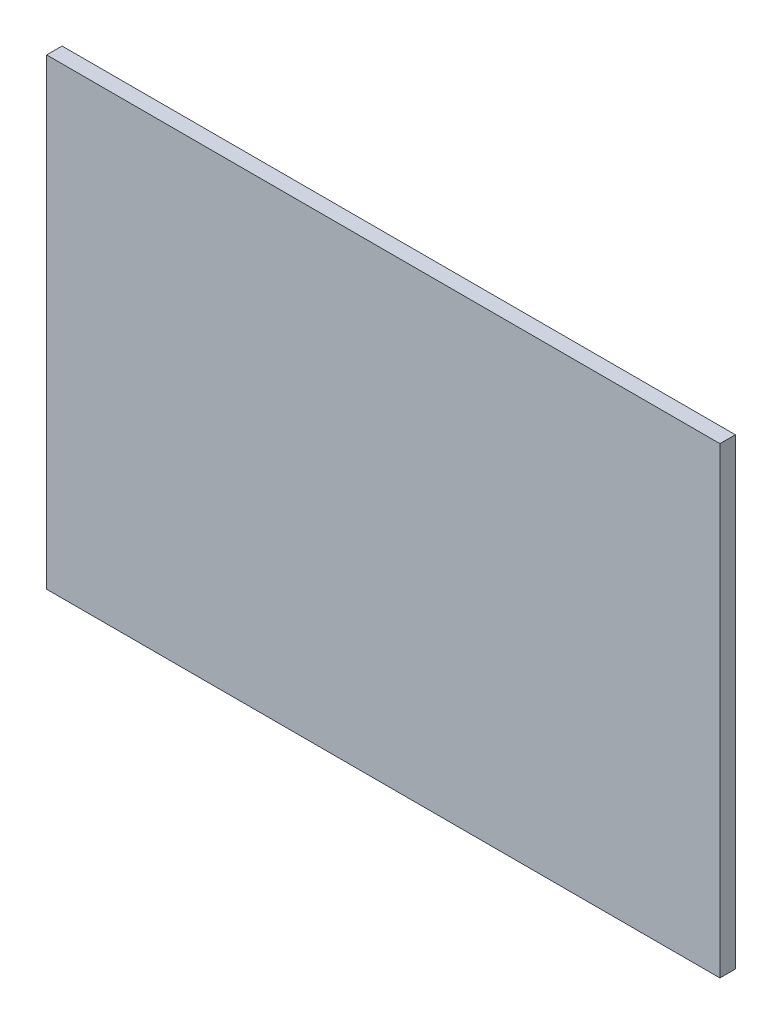
ISO-10303-21;
HEADER;
FILE_DESCRIPTION(('STEP AP214'),'2;1');
FILE_NAME('part.step','',(''),(''),'','','');
FILE_SCHEMA(('AUTOMOTIVE_DESIGN { 1 0 10303 214 1 1 1 1 }'));
ENDSEC;
DATA;
#1=APPLICATION_CONTEXT('core data for automotive mechanical design processes');
#2=APPLICATION_PROTOCOL_DEFINITION('international standard','automotive_design',2000,#1);
#3=PRODUCT_CONTEXT('',#1,'mechanical');
#4=PRODUCT('Part','Part','',(#3));
#5=PRODUCT_RELATED_PRODUCT_CATEGORY('part','',(#4));
#6=PRODUCT_DEFINITION_FORMATION('','',#4);
#7=PRODUCT_DEFINITION_CONTEXT('part definition',#1,'design');
#8=PRODUCT_DEFINITION('design','',#6,#7);
#9=PRODUCT_DEFINITION_SHAPE('','',#8);
#10=(LENGTH_UNIT() NAMED_UNIT(*) SI_UNIT(.MILLI.,.METRE.));
#11=(NAMED_UNIT(*) PLANE_ANGLE_UNIT() SI_UNIT($,.RADIAN.));
#12=(NAMED_UNIT(*) SI_UNIT($,.STERADIAN.) SOLID_ANGLE_UNIT());
#13=UNCERTAINTY_MEASURE_WITH_UNIT(LENGTH_MEASURE(1.E-05),#10,'distance_accuracy_value','');
#14=(GEOMETRIC_REPRESENTATION_CONTEXT(3) GLOBAL_UNCERTAINTY_ASSIGNED_CONTEXT((#13)) GLOBAL_UNIT_ASSIGNED_CONTEXT((#10,
#11,#12)) REPRESENTATION_CONTEXT('',''));
#15=CARTESIAN_POINT('',(0.,0.,0.));
#16=DIRECTION('',(0.,0.,1.));
#17=DIRECTION('',(1.,0.,0.));
#18=AXIS2_PLACEMENT_3D('',#15,#16,#17);
#19=CARTESIAN_POINT('',(-52.5537313432836,24.2138059701493,2.));
#20=DIRECTION('',(1.,0.,0.));
#21=DIRECTION('',(0.,1.,0.));
#22=AXIS2_PLACEMENT_3D('',#19,#20,#21);
#23=PLANE('',#22);
#24=DIRECTION('',(0.,-1.,0.));
#25=VECTOR('',#24,1.);
#26=CARTESIAN_POINT('',(-52.5537313432836,24.2138059701493,0.));
#27=LINE('',#26,#25);
#28=CARTESIAN_POINT('',(-52.5537313432836,24.2138059701493,0.));
#29=VERTEX_POINT('',#28);
#30=CARTESIAN_POINT('',(-52.5537313432836,-35.7861940298507,0.));
#31=VERTEX_POINT('',#30);
#32=EDGE_CURVE('E96',#29,#31,#27,.T.);
#33=ORIENTED_EDGE('',*,*,#32,.T.);
#34=DIRECTION('',(0.,0.,-1.));
#35=VECTOR('',#34,1.);
#36=CARTESIAN_POINT('',(-52.5537313432836,-35.7861940298507,2.));
#37=LINE('',#36,#35);
#38=CARTESIAN_POINT('',(-52.5537313432836,-35.7861940298507,2.));
#39=VERTEX_POINT('',#38);
#40=EDGE_CURVE('E11',#39,#31,#37,.T.);
#41=ORIENTED_EDGE('',*,*,#40,.F.);
#42=DIRECTION('',(0.,-1.,0.));
#43=VECTOR('',#42,1.);
#44=CARTESIAN_POINT('',(-52.5537313432836,24.2138059701493,2.));
#45=LINE('',#44,#43);
#46=CARTESIAN_POINT('',(-52.5537313432836,24.2138059701493,2.));
#47=VERTEX_POINT('',#46);
#48=EDGE_CURVE('E84',#47,#39,#45,.T.);
#49=ORIENTED_EDGE('',*,*,#48,.F.);
#50=DIRECTION('',(0.,0.,-1.));
#51=VECTOR('',#50,1.);
#52=CARTESIAN_POINT('',(-52.5537313432836,24.2138059701493,2.));
#53=LINE('',#52,#51);
#54=EDGE_CURVE('E92',#47,#29,#53,.T.);
#55=ORIENTED_EDGE('',*,*,#54,.T.);
#56=EDGE_LOOP('',(#33,#41,#49,#55));
#57=FACE_BOUND('',#56,.T.);
#58=ADVANCED_FACE('F33',(#57),#23,.F.);
#59=CARTESIAN_POINT('',(-52.5537313432836,-35.7861940298507,2.));
#60=DIRECTION('',(0.,1.,0.));
#61=DIRECTION('',(0.,0.,1.));
#62=AXIS2_PLACEMENT_3D('',#59,#60,#61);
#63=PLANE('',#62);
#64=DIRECTION('',(1.,0.,0.));
#65=VECTOR('',#64,1.);
#66=CARTESIAN_POINT('',(-52.5537313432836,-35.7861940298507,0.));
#67=LINE('',#66,#65);
#68=CARTESIAN_POINT('',(34.7462686567164,-35.7861940298507,0.));
#69=VERTEX_POINT('',#68);
#70=EDGE_CURVE('E88',#31,#69,#67,.T.);
#71=ORIENTED_EDGE('',*,*,#70,.T.);
#72=DIRECTION('',(0.,0.,-1.));
#73=VECTOR('',#72,1.);
#74=CARTESIAN_POINT('',(34.7462686567164,-35.7861940298507,2.));
#75=LINE('',#74,#73);
#76=CARTESIAN_POINT('',(34.7462686567164,-35.7861940298507,2.));
#77=VERTEX_POINT('',#76);
#78=EDGE_CURVE('E41',#77,#69,#75,.T.);
#79=ORIENTED_EDGE('',*,*,#78,.F.);
#80=DIRECTION('',(1.,0.,0.));
#81=VECTOR('',#80,1.);
#82=CARTESIAN_POINT('',(-52.5537313432836,-35.7861940298507,2.));
#83=LINE('',#82,#81);
#84=EDGE_CURVE('E79',#39,#77,#83,.T.);
#85=ORIENTED_EDGE('',*,*,#84,.F.);
#86=ORIENTED_EDGE('',*,*,#40,.T.);
#87=EDGE_LOOP('',(#71,#79,#85,#86));
#88=FACE_BOUND('',#87,.T.);
#89=ADVANCED_FACE('F87',(#88),#63,.F.);
#90=CARTESIAN_POINT('',(34.7462686567164,24.2138059701493,2.));
#91=DIRECTION('',(-1.,0.,0.));
#92=DIRECTION('',(0.,0.,1.));
#93=AXIS2_PLACEMENT_3D('',#90,#91,#92);
#94=PLANE('',#93);
#95=DIRECTION('',(0.,1.,0.));
#96=VECTOR('',#95,1.);
#97=CARTESIAN_POINT('',(34.7462686567164,24.2138059701493,0.));
#98=LINE('',#97,#96);
#99=CARTESIAN_POINT('',(34.7462686567164,24.2138059701493,0.));
#100=VERTEX_POINT('',#99);
#101=EDGE_CURVE('E66',#69,#100,#98,.T.);
#102=ORIENTED_EDGE('',*,*,#101,.T.);
#103=DIRECTION('',(0.,0.,-1.));
#104=VECTOR('',#103,1.);
#105=CARTESIAN_POINT('',(34.7462686567164,24.2138059701493,2.));
#106=LINE('',#105,#104);
#107=CARTESIAN_POINT('',(34.7462686567164,24.2138059701493,2.));
#108=VERTEX_POINT('',#107);
#109=EDGE_CURVE('E89',#108,#100,#106,.T.);
#110=ORIENTED_EDGE('',*,*,#109,.F.);
#111=DIRECTION('',(0.,1.,0.));
#112=VECTOR('',#111,1.);
#113=CARTESIAN_POINT('',(34.7462686567164,24.2138059701493,2.));
#114=LINE('',#113,#112);
#115=EDGE_CURVE('E82',#77,#108,#114,.T.);
#116=ORIENTED_EDGE('',*,*,#115,.F.);
#117=ORIENTED_EDGE('',*,*,#78,.T.);
#118=EDGE_LOOP('',(#102,#110,#116,#117));
#119=FACE_BOUND('',#118,.T.);
#120=ADVANCED_FACE('F90',(#119),#94,.F.);
#121=CARTESIAN_POINT('',(-52.5537313432836,24.2138059701493,2.));
#122=DIRECTION('',(0.,-1.,0.));
#123=DIRECTION('',(0.,0.,-1.));
#124=AXIS2_PLACEMENT_3D('',#121,#122,#123);
#125=PLANE('',#124);
#126=DIRECTION('',(-1.,0.,0.));
#127=VECTOR('',#126,1.);
#128=CARTESIAN_POINT('',(-52.5537313432836,24.2138059701493,0.));
#129=LINE('',#128,#127);
#130=EDGE_CURVE('E72',#100,#29,#129,.T.);
#131=ORIENTED_EDGE('',*,*,#130,.T.);
#132=ORIENTED_EDGE('',*,*,#54,.F.);
#133=DIRECTION('',(-1.,0.,0.));
#134=VECTOR('',#133,1.);
#135=CARTESIAN_POINT('',(-52.5537313432836,24.2138059701493,2.));
#136=LINE('',#135,#134);
#137=EDGE_CURVE('E49',#108,#47,#136,.T.);
#138=ORIENTED_EDGE('',*,*,#137,.F.);
#139=ORIENTED_EDGE('',*,*,#109,.T.);
#140=EDGE_LOOP('',(#131,#132,#138,#139));
#141=FACE_BOUND('',#140,.T.);
#142=ADVANCED_FACE('F103',(#141),#125,.F.);
#143=CARTESIAN_POINT('',(0.,0.,2.));
#144=DIRECTION('',(0.,0.,1.));
#145=DIRECTION('',(1.,0.,0.));
#146=AXIS2_PLACEMENT_3D('',#143,#144,#145);
#147=PLANE('',#146);
#148=ORIENTED_EDGE('',*,*,#48,.T.);
#149=ORIENTED_EDGE('',*,*,#84,.T.);
#150=ORIENTED_EDGE('',*,*,#115,.T.);
#151=ORIENTED_EDGE('',*,*,#137,.T.);
#152=EDGE_LOOP('',(#148,#149,#150,#151));
#153=FACE_BOUND('',#152,.T.);
#154=ADVANCED_FACE('F80',(#153),#147,.T.);
#155=CARTESIAN_POINT('',(0.,0.,0.));
#156=DIRECTION('',(0.,0.,1.));
#157=DIRECTION('',(1.,0.,0.));
#158=AXIS2_PLACEMENT_3D('',#155,#156,#157);
#159=PLANE('',#158);
#160=ORIENTED_EDGE('',*,*,#32,.F.);
#161=ORIENTED_EDGE('',*,*,#130,.F.);
#162=ORIENTED_EDGE('',*,*,#101,.F.);
#163=ORIENTED_EDGE('',*,*,#70,.F.);
#164=EDGE_LOOP('',(#160,#161,#162,#163));
#165=FACE_BOUND('',#164,.T.);
#166=ADVANCED_FACE('F106',(#165),#159,.F.);
#167=CLOSED_SHELL('',(#58,#89,#120,#142,#154,#166));
#168=MANIFOLD_SOLID_BREP('B2',#167);
#169=ADVANCED_BREP_SHAPE_REPRESENTATION('',(#18,#168),#14);
#170=SHAPE_DEFINITION_REPRESENTATION(#9,#169);
ENDSEC;
END-ISO-10303-21;
